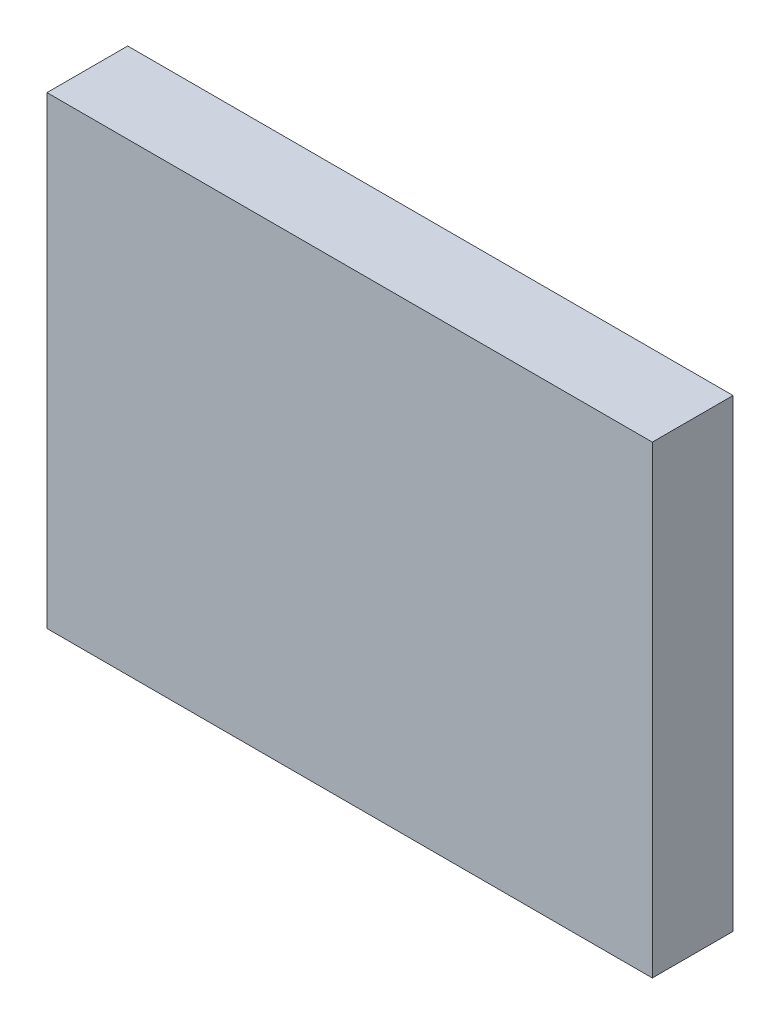
ISO-10303-21;
HEADER;
FILE_DESCRIPTION(('STEP AP214'),'2;1');
FILE_NAME('part.step','',(''),(''),'','','');
FILE_SCHEMA(('AUTOMOTIVE_DESIGN { 1 0 10303 214 1 1 1 1 }'));
ENDSEC;
DATA;
#1=APPLICATION_CONTEXT('core data for automotive mechanical design processes');
#2=APPLICATION_PROTOCOL_DEFINITION('international standard','automotive_design',2000,#1);
#3=PRODUCT_CONTEXT('',#1,'mechanical');
#4=PRODUCT('Part','Part','',(#3));
#5=PRODUCT_RELATED_PRODUCT_CATEGORY('part','',(#4));
#6=PRODUCT_DEFINITION_FORMATION('','',#4);
#7=PRODUCT_DEFINITION_CONTEXT('part definition',#1,'design');
#8=PRODUCT_DEFINITION('design','',#6,#7);
#9=PRODUCT_DEFINITION_SHAPE('','',#8);
#10=(LENGTH_UNIT() NAMED_UNIT(*) SI_UNIT(.MILLI.,.METRE.));
#11=(NAMED_UNIT(*) PLANE_ANGLE_UNIT() SI_UNIT($,.RADIAN.));
#12=(NAMED_UNIT(*) SI_UNIT($,.STERADIAN.) SOLID_ANGLE_UNIT());
#13=UNCERTAINTY_MEASURE_WITH_UNIT(LENGTH_MEASURE(1.E-05),#10,'distance_accuracy_value','');
#14=(GEOMETRIC_REPRESENTATION_CONTEXT(3) GLOBAL_UNCERTAINTY_ASSIGNED_CONTEXT((#13)) GLOBAL_UNIT_ASSIGNED_CONTEXT((#10,
#11,#12)) REPRESENTATION_CONTEXT('',''));
#15=CARTESIAN_POINT('',(0.,0.,0.));
#16=DIRECTION('',(0.,0.,1.));
#17=DIRECTION('',(1.,0.,0.));
#18=AXIS2_PLACEMENT_3D('',#15,#16,#17);
#19=CARTESIAN_POINT('',(-6.64804469273744,5.67039106145252,2.));
#20=DIRECTION('',(1.,0.,0.));
#21=DIRECTION('',(0.,1.,0.));
#22=AXIS2_PLACEMENT_3D('',#19,#20,#21);
#23=PLANE('',#22);
#24=DIRECTION('',(0.,-1.,0.));
#25=VECTOR('',#24,1.);
#26=CARTESIAN_POINT('',(-6.64804469273744,5.67039106145252,0.));
#27=LINE('',#26,#25);
#28=CARTESIAN_POINT('',(-6.64804469273744,5.67039106145252,0.));
#29=VERTEX_POINT('',#28);
#30=CARTESIAN_POINT('',(-6.64804469273743,-5.82960893854748,0.));
#31=VERTEX_POINT('',#30);
#32=EDGE_CURVE('E96',#29,#31,#27,.T.);
#33=ORIENTED_EDGE('',*,*,#32,.T.);
#34=DIRECTION('',(0.,0.,-1.));
#35=VECTOR('',#34,1.);
#36=CARTESIAN_POINT('',(-6.64804469273743,-5.82960893854748,2.));
#37=LINE('',#36,#35);
#38=CARTESIAN_POINT('',(-6.64804469273743,-5.82960893854748,2.));
#39=VERTEX_POINT('',#38);
#40=EDGE_CURVE('E11',#39,#31,#37,.T.);
#41=ORIENTED_EDGE('',*,*,#40,.F.);
#42=DIRECTION('',(0.,-1.,0.));
#43=VECTOR('',#42,1.);
#44=CARTESIAN_POINT('',(-6.64804469273744,5.67039106145252,2.));
#45=LINE('',#44,#43);
#46=CARTESIAN_POINT('',(-6.64804469273744,5.67039106145252,2.));
#47=VERTEX_POINT('',#46);
#48=EDGE_CURVE('E84',#47,#39,#45,.T.);
#49=ORIENTED_EDGE('',*,*,#48,.F.);
#50=DIRECTION('',(0.,0.,-1.));
#51=VECTOR('',#50,1.);
#52=CARTESIAN_POINT('',(-6.64804469273744,5.67039106145252,2.));
#53=LINE('',#52,#51);
#54=EDGE_CURVE('E92',#47,#29,#53,.T.);
#55=ORIENTED_EDGE('',*,*,#54,.T.);
#56=EDGE_LOOP('',(#33,#41,#49,#55));
#57=FACE_BOUND('',#56,.T.);
#58=ADVANCED_FACE('F33',(#57),#23,.F.);
#59=CARTESIAN_POINT('',(-6.64804469273743,-5.82960893854748,2.));
#60=DIRECTION('',(0.,1.,0.));
#61=DIRECTION('',(0.,0.,1.));
#62=AXIS2_PLACEMENT_3D('',#59,#60,#61);
#63=PLANE('',#62);
#64=DIRECTION('',(1.,0.,0.));
#65=VECTOR('',#64,1.);
#66=CARTESIAN_POINT('',(-6.64804469273743,-5.82960893854748,0.));
#67=LINE('',#66,#65);
#68=CARTESIAN_POINT('',(8.35195530726256,-5.82960893854748,0.));
#69=VERTEX_POINT('',#68);
#70=EDGE_CURVE('E88',#31,#69,#67,.T.);
#71=ORIENTED_EDGE('',*,*,#70,.T.);
#72=DIRECTION('',(0.,0.,-1.));
#73=VECTOR('',#72,1.);
#74=CARTESIAN_POINT('',(8.35195530726256,-5.82960893854748,2.));
#75=LINE('',#74,#73);
#76=CARTESIAN_POINT('',(8.35195530726256,-5.82960893854748,2.));
#77=VERTEX_POINT('',#76);
#78=EDGE_CURVE('E41',#77,#69,#75,.T.);
#79=ORIENTED_EDGE('',*,*,#78,.F.);
#80=DIRECTION('',(1.,0.,0.));
#81=VECTOR('',#80,1.);
#82=CARTESIAN_POINT('',(-6.64804469273743,-5.82960893854748,2.));
#83=LINE('',#82,#81);
#84=EDGE_CURVE('E79',#39,#77,#83,.T.);
#85=ORIENTED_EDGE('',*,*,#84,.F.);
#86=ORIENTED_EDGE('',*,*,#40,.T.);
#87=EDGE_LOOP('',(#71,#79,#85,#86));
#88=FACE_BOUND('',#87,.T.);
#89=ADVANCED_FACE('F87',(#88),#63,.F.);
#90=CARTESIAN_POINT('',(8.35195530726256,5.67039106145252,2.));
#91=DIRECTION('',(-1.,0.,0.));
#92=DIRECTION('',(0.,0.,1.));
#93=AXIS2_PLACEMENT_3D('',#90,#91,#92);
#94=PLANE('',#93);
#95=DIRECTION('',(0.,1.,0.));
#96=VECTOR('',#95,1.);
#97=CARTESIAN_POINT('',(8.35195530726256,5.67039106145252,0.));
#98=LINE('',#97,#96);
#99=CARTESIAN_POINT('',(8.35195530726256,5.67039106145252,0.));
#100=VERTEX_POINT('',#99);
#101=EDGE_CURVE('E66',#69,#100,#98,.T.);
#102=ORIENTED_EDGE('',*,*,#101,.T.);
#103=DIRECTION('',(0.,0.,-1.));
#104=VECTOR('',#103,1.);
#105=CARTESIAN_POINT('',(8.35195530726256,5.67039106145252,2.));
#106=LINE('',#105,#104);
#107=CARTESIAN_POINT('',(8.35195530726256,5.67039106145252,2.));
#108=VERTEX_POINT('',#107);
#109=EDGE_CURVE('E89',#108,#100,#106,.T.);
#110=ORIENTED_EDGE('',*,*,#109,.F.);
#111=DIRECTION('',(0.,1.,0.));
#112=VECTOR('',#111,1.);
#113=CARTESIAN_POINT('',(8.35195530726256,5.67039106145252,2.));
#114=LINE('',#113,#112);
#115=EDGE_CURVE('E82',#77,#108,#114,.T.);
#116=ORIENTED_EDGE('',*,*,#115,.F.);
#117=ORIENTED_EDGE('',*,*,#78,.T.);
#118=EDGE_LOOP('',(#102,#110,#116,#117));
#119=FACE_BOUND('',#118,.T.);
#120=ADVANCED_FACE('F90',(#119),#94,.F.);
#121=CARTESIAN_POINT('',(-6.64804469273744,5.67039106145252,2.));
#122=DIRECTION('',(0.,-1.,0.));
#123=DIRECTION('',(0.,0.,-1.));
#124=AXIS2_PLACEMENT_3D('',#121,#122,#123);
#125=PLANE('',#124);
#126=DIRECTION('',(-1.,0.,0.));
#127=VECTOR('',#126,1.);
#128=CARTESIAN_POINT('',(-6.64804469273744,5.67039106145252,0.));
#129=LINE('',#128,#127);
#130=EDGE_CURVE('E72',#100,#29,#129,.T.);
#131=ORIENTED_EDGE('',*,*,#130,.T.);
#132=ORIENTED_EDGE('',*,*,#54,.F.);
#133=DIRECTION('',(-1.,0.,0.));
#134=VECTOR('',#133,1.);
#135=CARTESIAN_POINT('',(-6.64804469273744,5.67039106145252,2.));
#136=LINE('',#135,#134);
#137=EDGE_CURVE('E49',#108,#47,#136,.T.);
#138=ORIENTED_EDGE('',*,*,#137,.F.);
#139=ORIENTED_EDGE('',*,*,#109,.T.);
#140=EDGE_LOOP('',(#131,#132,#138,#139));
#141=FACE_BOUND('',#140,.T.);
#142=ADVANCED_FACE('F103',(#141),#125,.F.);
#143=CARTESIAN_POINT('',(0.,0.,2.));
#144=DIRECTION('',(0.,0.,1.));
#145=DIRECTION('',(1.,0.,0.));
#146=AXIS2_PLACEMENT_3D('',#143,#144,#145);
#147=PLANE('',#146);
#148=ORIENTED_EDGE('',*,*,#48,.T.);
#149=ORIENTED_EDGE('',*,*,#84,.T.);
#150=ORIENTED_EDGE('',*,*,#115,.T.);
#151=ORIENTED_EDGE('',*,*,#137,.T.);
#152=EDGE_LOOP('',(#148,#149,#150,#151));
#153=FACE_BOUND('',#152,.T.);
#154=ADVANCED_FACE('F80',(#153),#147,.T.);
#155=CARTESIAN_POINT('',(0.,0.,0.));
#156=DIRECTION('',(0.,0.,1.));
#157=DIRECTION('',(1.,0.,0.));
#158=AXIS2_PLACEMENT_3D('',#155,#156,#157);
#159=PLANE('',#158);
#160=ORIENTED_EDGE('',*,*,#32,.F.);
#161=ORIENTED_EDGE('',*,*,#130,.F.);
#162=ORIENTED_EDGE('',*,*,#101,.F.);
#163=ORIENTED_EDGE('',*,*,#70,.F.);
#164=EDGE_LOOP('',(#160,#161,#162,#163));
#165=FACE_BOUND('',#164,.T.);
#166=ADVANCED_FACE('F106',(#165),#159,.F.);
#167=CLOSED_SHELL('',(#58,#89,#120,#142,#154,#166));
#168=MANIFOLD_SOLID_BREP('B2',#167);
#169=ADVANCED_BREP_SHAPE_REPRESENTATION('',(#18,#168),#14);
#170=SHAPE_DEFINITION_REPRESENTATION(#9,#169);
ENDSEC;
END-ISO-10303-21;
